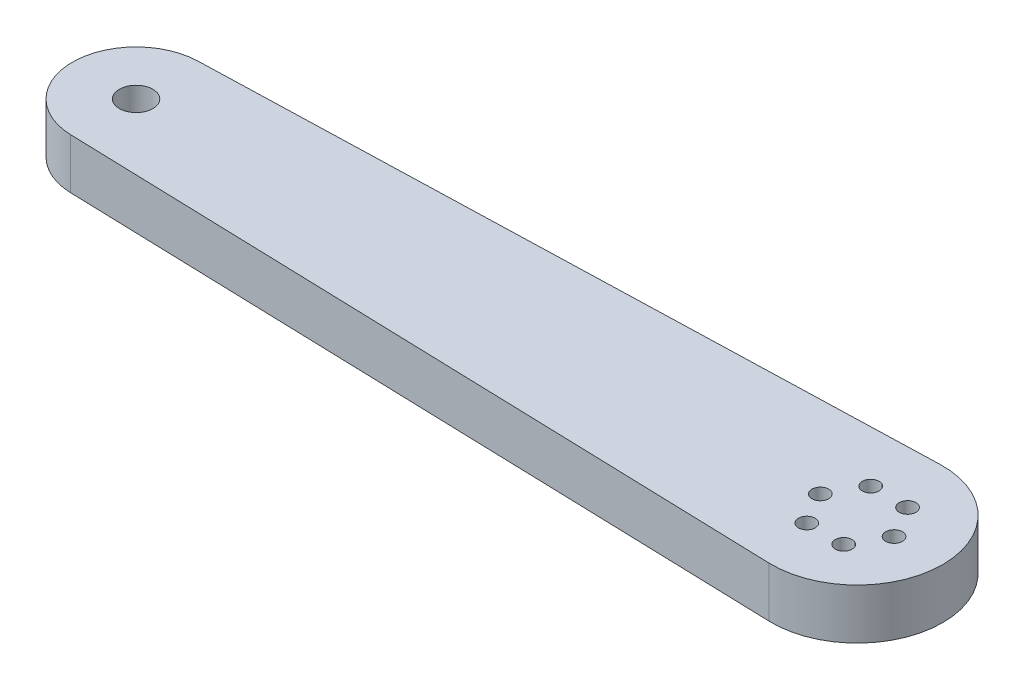
ISO-10303-21;
HEADER;
FILE_DESCRIPTION(('STEP AP214'),'2;1');
FILE_NAME('part.step','',(''),(''),'','','');
FILE_SCHEMA(('AUTOMOTIVE_DESIGN { 1 0 10303 214 1 1 1 1 }'));
ENDSEC;
DATA;
#1=APPLICATION_CONTEXT('core data for automotive mechanical design processes');
#2=APPLICATION_PROTOCOL_DEFINITION('international standard','automotive_design',2000,#1);
#3=PRODUCT_CONTEXT('',#1,'mechanical');
#4=PRODUCT('Part','Part','',(#3));
#5=PRODUCT_RELATED_PRODUCT_CATEGORY('part','',(#4));
#6=PRODUCT_DEFINITION_FORMATION('','',#4);
#7=PRODUCT_DEFINITION_CONTEXT('part definition',#1,'design');
#8=PRODUCT_DEFINITION('design','',#6,#7);
#9=PRODUCT_DEFINITION_SHAPE('','',#8);
#10=(LENGTH_UNIT() NAMED_UNIT(*) SI_UNIT(.MILLI.,.METRE.));
#11=(NAMED_UNIT(*) PLANE_ANGLE_UNIT() SI_UNIT($,.RADIAN.));
#12=(NAMED_UNIT(*) SI_UNIT($,.STERADIAN.) SOLID_ANGLE_UNIT());
#13=UNCERTAINTY_MEASURE_WITH_UNIT(LENGTH_MEASURE(1.E-05),#10,'distance_accuracy_value','');
#14=(GEOMETRIC_REPRESENTATION_CONTEXT(3) GLOBAL_UNCERTAINTY_ASSIGNED_CONTEXT((#13)) GLOBAL_UNIT_ASSIGNED_CONTEXT((#10,
#11,#12)) REPRESENTATION_CONTEXT('',''));
#15=CARTESIAN_POINT('',(0.,0.,0.));
#16=DIRECTION('',(0.,0.,1.));
#17=DIRECTION('',(1.,0.,0.));
#18=AXIS2_PLACEMENT_3D('',#15,#16,#17);
#19=CARTESIAN_POINT('',(0.,15.,0.));
#20=DIRECTION('',(0.,1.,0.));
#21=DIRECTION('',(0.,0.,1.));
#22=AXIS2_PLACEMENT_3D('',#19,#20,#21);
#23=PLANE('',#22);
#24=CARTESIAN_POINT('',(209.5,15.,9.52627944162886));
#25=DIRECTION('',(0.,1.,0.));
#26=DIRECTION('',(0.,0.,1.));
#27=AXIS2_PLACEMENT_3D('',#24,#25,#26);
#28=CIRCLE('',#27,2.5);
#29=CARTESIAN_POINT('',(209.5,15.,12.0262794416289));
#30=VERTEX_POINT('',#29);
#31=EDGE_CURVE('E168',#30,#30,#28,.T.);
#32=ORIENTED_EDGE('',*,*,#31,.F.);
#33=EDGE_LOOP('',(#32));
#34=FACE_BOUND('',#33,.T.);
#35=CARTESIAN_POINT('',(226.,15.,0.));
#36=DIRECTION('',(0.,1.,0.));
#37=DIRECTION('',(0.,0.,1.));
#38=AXIS2_PLACEMENT_3D('',#35,#36,#37);
#39=CIRCLE('',#38,2.5);
#40=CARTESIAN_POINT('',(226.,15.,2.49999999999998));
#41=VERTEX_POINT('',#40);
#42=EDGE_CURVE('E152',#41,#41,#39,.T.);
#43=ORIENTED_EDGE('',*,*,#42,.F.);
#44=EDGE_LOOP('',(#43));
#45=FACE_BOUND('',#44,.T.);
#46=CARTESIAN_POINT('',(220.5,15.,-9.52627944162881));
#47=DIRECTION('',(0.,1.,0.));
#48=DIRECTION('',(0.,0.,1.));
#49=AXIS2_PLACEMENT_3D('',#46,#47,#48);
#50=CIRCLE('',#49,2.5);
#51=CARTESIAN_POINT('',(220.5,15.,-7.02627944162882));
#52=VERTEX_POINT('',#51);
#53=EDGE_CURVE('E136',#52,#52,#50,.T.);
#54=ORIENTED_EDGE('',*,*,#53,.F.);
#55=EDGE_LOOP('',(#54));
#56=FACE_BOUND('',#55,.T.);
#57=CARTESIAN_POINT('',(0.,15.,0.));
#58=DIRECTION('',(0.,1.,0.));
#59=DIRECTION('',(0.,0.,1.));
#60=AXIS2_PLACEMENT_3D('',#57,#58,#59);
#61=CIRCLE('',#60,19.);
#62=CARTESIAN_POINT('',(-0.574418604651163,15.,-18.9913149430636));
#63=VERTEX_POINT('',#62);
#64=CARTESIAN_POINT('',(-0.574418604651163,15.,18.9913149430636));
#65=VERTEX_POINT('',#64);
#66=EDGE_CURVE('E94',#63,#65,#61,.T.);
#67=ORIENTED_EDGE('',*,*,#66,.T.);
#68=DIRECTION('',(0.999542891740189,0.,0.0302325581395349));
#69=VECTOR('',#68,1.);
#70=CARTESIAN_POINT('',(-0.574418604651163,15.,18.9913149430636));
#71=LINE('',#70,#69);
#72=CARTESIAN_POINT('',(214.229069767442,15.,25.4883437393748));
#73=VERTEX_POINT('',#72);
#74=EDGE_CURVE('E89',#65,#73,#71,.T.);
#75=ORIENTED_EDGE('',*,*,#74,.T.);
#76=CARTESIAN_POINT('',(215.,15.,0.));
#77=DIRECTION('',(0.,1.,0.));
#78=DIRECTION('',(0.,0.,-1.));
#79=AXIS2_PLACEMENT_3D('',#76,#77,#78);
#80=CIRCLE('',#79,25.5);
#81=CARTESIAN_POINT('',(214.229069767442,15.,-25.4883437393748));
#82=VERTEX_POINT('',#81);
#83=EDGE_CURVE('E92',#73,#82,#80,.T.);
#84=ORIENTED_EDGE('',*,*,#83,.T.);
#85=DIRECTION('',(-0.999542891740189,0.,0.0302325581395349));
#86=VECTOR('',#85,1.);
#87=CARTESIAN_POINT('',(-0.574418604651163,15.,-18.9913149430636));
#88=LINE('',#87,#86);
#89=EDGE_CURVE('E59',#82,#63,#88,.T.);
#90=ORIENTED_EDGE('',*,*,#89,.T.);
#91=EDGE_LOOP('',(#67,#75,#84,#90));
#92=FACE_BOUND('',#91,.T.);
#93=CARTESIAN_POINT('',(0.,15.,0.));
#94=DIRECTION('',(0.,1.,0.));
#95=DIRECTION('',(0.,0.,1.));
#96=AXIS2_PLACEMENT_3D('',#93,#94,#95);
#97=CIRCLE('',#96,5.);
#98=CARTESIAN_POINT('',(0.,15.,5.));
#99=VERTEX_POINT('',#98);
#100=EDGE_CURVE('E114',#99,#99,#97,.T.);
#101=ORIENTED_EDGE('',*,*,#100,.F.);
#102=EDGE_LOOP('',(#101));
#103=FACE_BOUND('',#102,.T.);
#104=CARTESIAN_POINT('',(209.5,15.,-9.52627944162881));
#105=DIRECTION('',(0.,1.,0.));
#106=DIRECTION('',(0.,0.,1.));
#107=AXIS2_PLACEMENT_3D('',#104,#105,#106);
#108=CIRCLE('',#107,2.5);
#109=CARTESIAN_POINT('',(209.5,15.,-7.02627944162882));
#110=VERTEX_POINT('',#109);
#111=EDGE_CURVE('E144',#110,#110,#108,.T.);
#112=ORIENTED_EDGE('',*,*,#111,.F.);
#113=EDGE_LOOP('',(#112));
#114=FACE_BOUND('',#113,.T.);
#115=CARTESIAN_POINT('',(220.5,15.,9.52627944162886));
#116=DIRECTION('',(0.,1.,0.));
#117=DIRECTION('',(0.,0.,1.));
#118=AXIS2_PLACEMENT_3D('',#115,#116,#117);
#119=CIRCLE('',#118,2.5);
#120=CARTESIAN_POINT('',(220.5,15.,12.0262794416289));
#121=VERTEX_POINT('',#120);
#122=EDGE_CURVE('E160',#121,#121,#119,.T.);
#123=ORIENTED_EDGE('',*,*,#122,.F.);
#124=EDGE_LOOP('',(#123));
#125=FACE_BOUND('',#124,.T.);
#126=CARTESIAN_POINT('',(204.,15.,0.));
#127=DIRECTION('',(0.,1.,0.));
#128=DIRECTION('',(0.,0.,1.));
#129=AXIS2_PLACEMENT_3D('',#126,#127,#128);
#130=CIRCLE('',#129,2.5);
#131=CARTESIAN_POINT('',(204.,15.,2.49999999999999));
#132=VERTEX_POINT('',#131);
#133=EDGE_CURVE('E176',#132,#132,#130,.T.);
#134=ORIENTED_EDGE('',*,*,#133,.F.);
#135=EDGE_LOOP('',(#134));
#136=FACE_BOUND('',#135,.T.);
#137=ADVANCED_FACE('F41',(#34,#45,#56,#92,#103,#114,#125,#136),#23,.T.);
#138=CARTESIAN_POINT('',(0.,0.,0.));
#139=DIRECTION('',(0.,1.,0.));
#140=DIRECTION('',(0.,0.,1.));
#141=AXIS2_PLACEMENT_3D('',#138,#139,#140);
#142=PLANE('',#141);
#143=CARTESIAN_POINT('',(0.,0.,0.));
#144=DIRECTION('',(0.,1.,0.));
#145=DIRECTION('',(0.,0.,1.));
#146=AXIS2_PLACEMENT_3D('',#143,#144,#145);
#147=CIRCLE('',#146,19.);
#148=CARTESIAN_POINT('',(-0.574418604651163,0.,-18.9913149430636));
#149=VERTEX_POINT('',#148);
#150=CARTESIAN_POINT('',(-0.574418604651163,0.,18.9913149430636));
#151=VERTEX_POINT('',#150);
#152=EDGE_CURVE('E110',#149,#151,#147,.T.);
#153=ORIENTED_EDGE('',*,*,#152,.F.);
#154=DIRECTION('',(-0.999542891740189,0.,0.0302325581395349));
#155=VECTOR('',#154,1.);
#156=CARTESIAN_POINT('',(-0.574418604651163,0.,-18.9913149430636));
#157=LINE('',#156,#155);
#158=CARTESIAN_POINT('',(214.229069767442,0.,-25.4883437393748));
#159=VERTEX_POINT('',#158);
#160=EDGE_CURVE('E82',#159,#149,#157,.T.);
#161=ORIENTED_EDGE('',*,*,#160,.F.);
#162=CARTESIAN_POINT('',(215.,0.,0.));
#163=DIRECTION('',(0.,1.,0.));
#164=DIRECTION('',(0.,0.,-1.));
#165=AXIS2_PLACEMENT_3D('',#162,#163,#164);
#166=CIRCLE('',#165,25.5);
#167=CARTESIAN_POINT('',(214.229069767442,0.,25.4883437393748));
#168=VERTEX_POINT('',#167);
#169=EDGE_CURVE('E76',#168,#159,#166,.T.);
#170=ORIENTED_EDGE('',*,*,#169,.F.);
#171=DIRECTION('',(0.999542891740189,0.,0.0302325581395349));
#172=VECTOR('',#171,1.);
#173=CARTESIAN_POINT('',(-0.574418604651163,0.,18.9913149430636));
#174=LINE('',#173,#172);
#175=EDGE_CURVE('E99',#151,#168,#174,.T.);
#176=ORIENTED_EDGE('',*,*,#175,.F.);
#177=EDGE_LOOP('',(#153,#161,#170,#176));
#178=FACE_BOUND('',#177,.T.);
#179=CARTESIAN_POINT('',(0.,0.,0.));
#180=DIRECTION('',(0.,1.,0.));
#181=DIRECTION('',(0.,0.,1.));
#182=AXIS2_PLACEMENT_3D('',#179,#180,#181);
#183=CIRCLE('',#182,5.);
#184=CARTESIAN_POINT('',(0.,0.,5.));
#185=VERTEX_POINT('',#184);
#186=EDGE_CURVE('E132',#185,#185,#183,.T.);
#187=ORIENTED_EDGE('',*,*,#186,.T.);
#188=EDGE_LOOP('',(#187));
#189=FACE_BOUND('',#188,.T.);
#190=CARTESIAN_POINT('',(220.5,0.,-9.52627944162881));
#191=DIRECTION('',(0.,1.,0.));
#192=DIRECTION('',(0.,0.,1.));
#193=AXIS2_PLACEMENT_3D('',#190,#191,#192);
#194=CIRCLE('',#193,2.5);
#195=CARTESIAN_POINT('',(220.5,0.,-7.02627944162882));
#196=VERTEX_POINT('',#195);
#197=EDGE_CURVE('E140',#196,#196,#194,.T.);
#198=ORIENTED_EDGE('',*,*,#197,.T.);
#199=EDGE_LOOP('',(#198));
#200=FACE_BOUND('',#199,.T.);
#201=CARTESIAN_POINT('',(209.5,0.,-9.52627944162881));
#202=DIRECTION('',(0.,1.,0.));
#203=DIRECTION('',(0.,0.,1.));
#204=AXIS2_PLACEMENT_3D('',#201,#202,#203);
#205=CIRCLE('',#204,2.5);
#206=CARTESIAN_POINT('',(209.5,0.,-7.02627944162882));
#207=VERTEX_POINT('',#206);
#208=EDGE_CURVE('E148',#207,#207,#205,.T.);
#209=ORIENTED_EDGE('',*,*,#208,.T.);
#210=EDGE_LOOP('',(#209));
#211=FACE_BOUND('',#210,.T.);
#212=CARTESIAN_POINT('',(226.,0.,0.));
#213=DIRECTION('',(0.,1.,0.));
#214=DIRECTION('',(0.,0.,1.));
#215=AXIS2_PLACEMENT_3D('',#212,#213,#214);
#216=CIRCLE('',#215,2.5);
#217=CARTESIAN_POINT('',(226.,0.,2.49999999999998));
#218=VERTEX_POINT('',#217);
#219=EDGE_CURVE('E156',#218,#218,#216,.T.);
#220=ORIENTED_EDGE('',*,*,#219,.T.);
#221=EDGE_LOOP('',(#220));
#222=FACE_BOUND('',#221,.T.);
#223=CARTESIAN_POINT('',(220.5,0.,9.52627944162886));
#224=DIRECTION('',(0.,1.,0.));
#225=DIRECTION('',(0.,0.,1.));
#226=AXIS2_PLACEMENT_3D('',#223,#224,#225);
#227=CIRCLE('',#226,2.5);
#228=CARTESIAN_POINT('',(220.5,0.,12.0262794416289));
#229=VERTEX_POINT('',#228);
#230=EDGE_CURVE('E164',#229,#229,#227,.T.);
#231=ORIENTED_EDGE('',*,*,#230,.T.);
#232=EDGE_LOOP('',(#231));
#233=FACE_BOUND('',#232,.T.);
#234=CARTESIAN_POINT('',(209.5,0.,9.52627944162886));
#235=DIRECTION('',(0.,1.,0.));
#236=DIRECTION('',(0.,0.,1.));
#237=AXIS2_PLACEMENT_3D('',#234,#235,#236);
#238=CIRCLE('',#237,2.5);
#239=CARTESIAN_POINT('',(209.5,0.,12.0262794416289));
#240=VERTEX_POINT('',#239);
#241=EDGE_CURVE('E172',#240,#240,#238,.T.);
#242=ORIENTED_EDGE('',*,*,#241,.T.);
#243=EDGE_LOOP('',(#242));
#244=FACE_BOUND('',#243,.T.);
#245=CARTESIAN_POINT('',(204.,0.,0.));
#246=DIRECTION('',(0.,1.,0.));
#247=DIRECTION('',(0.,0.,1.));
#248=AXIS2_PLACEMENT_3D('',#245,#246,#247);
#249=CIRCLE('',#248,2.5);
#250=CARTESIAN_POINT('',(204.,0.,2.49999999999999));
#251=VERTEX_POINT('',#250);
#252=EDGE_CURVE('E180',#251,#251,#249,.T.);
#253=ORIENTED_EDGE('',*,*,#252,.T.);
#254=EDGE_LOOP('',(#253));
#255=FACE_BOUND('',#254,.T.);
#256=ADVANCED_FACE('F127',(#178,#189,#200,#211,#222,#233,#244,#255),#142,.F.);
#257=CARTESIAN_POINT('',(0.,15.,0.));
#258=DIRECTION('',(0.,-1.,0.));
#259=DIRECTION('',(0.,0.,-1.));
#260=AXIS2_PLACEMENT_3D('',#257,#258,#259);
#261=CYLINDRICAL_SURFACE('',#260,19.);
#262=ORIENTED_EDGE('',*,*,#152,.T.);
#263=DIRECTION('',(0.,-1.,0.));
#264=VECTOR('',#263,1.);
#265=CARTESIAN_POINT('',(-0.574418604651163,15.,18.9913149430636));
#266=LINE('',#265,#264);
#267=EDGE_CURVE('E11',#65,#151,#266,.T.);
#268=ORIENTED_EDGE('',*,*,#267,.F.);
#269=ORIENTED_EDGE('',*,*,#66,.F.);
#270=DIRECTION('',(0.,-1.,0.));
#271=VECTOR('',#270,1.);
#272=CARTESIAN_POINT('',(-0.574418604651163,15.,-18.9913149430636));
#273=LINE('',#272,#271);
#274=EDGE_CURVE('E106',#63,#149,#273,.T.);
#275=ORIENTED_EDGE('',*,*,#274,.T.);
#276=EDGE_LOOP('',(#262,#268,#269,#275));
#277=FACE_BOUND('',#276,.T.);
#278=ADVANCED_FACE('F43',(#277),#261,.T.);
#279=CARTESIAN_POINT('',(-0.574418604651163,15.,18.9913149430636));
#280=DIRECTION('',(0.0302325581395349,0.,-0.999542891740189));
#281=DIRECTION('',(-0.999542891740189,0.,-0.0302325581395349));
#282=AXIS2_PLACEMENT_3D('',#279,#280,#281);
#283=PLANE('',#282);
#284=ORIENTED_EDGE('',*,*,#175,.T.);
#285=DIRECTION('',(0.,-1.,0.));
#286=VECTOR('',#285,1.);
#287=CARTESIAN_POINT('',(214.229069767442,15.,25.4883437393748));
#288=LINE('',#287,#286);
#289=EDGE_CURVE('E51',#73,#168,#288,.T.);
#290=ORIENTED_EDGE('',*,*,#289,.F.);
#291=ORIENTED_EDGE('',*,*,#74,.F.);
#292=ORIENTED_EDGE('',*,*,#267,.T.);
#293=EDGE_LOOP('',(#284,#290,#291,#292));
#294=FACE_BOUND('',#293,.T.);
#295=ADVANCED_FACE('F98',(#294),#283,.F.);
#296=CARTESIAN_POINT('',(215.,15.,0.));
#297=DIRECTION('',(0.,-1.,0.));
#298=DIRECTION('',(0.,0.,-1.));
#299=AXIS2_PLACEMENT_3D('',#296,#297,#298);
#300=CYLINDRICAL_SURFACE('',#299,25.5);
#301=ORIENTED_EDGE('',*,*,#169,.T.);
#302=DIRECTION('',(0.,-1.,0.));
#303=VECTOR('',#302,1.);
#304=CARTESIAN_POINT('',(214.229069767442,15.,-25.4883437393748));
#305=LINE('',#304,#303);
#306=EDGE_CURVE('E101',#82,#159,#305,.T.);
#307=ORIENTED_EDGE('',*,*,#306,.F.);
#308=ORIENTED_EDGE('',*,*,#83,.F.);
#309=ORIENTED_EDGE('',*,*,#289,.T.);
#310=EDGE_LOOP('',(#301,#307,#308,#309));
#311=FACE_BOUND('',#310,.T.);
#312=ADVANCED_FACE('F102',(#311),#300,.T.);
#313=CARTESIAN_POINT('',(-0.574418604651163,15.,-18.9913149430636));
#314=DIRECTION('',(0.0302325581395349,0.,0.999542891740189));
#315=DIRECTION('',(0.999542891740189,0.,-0.0302325581395349));
#316=AXIS2_PLACEMENT_3D('',#313,#314,#315);
#317=PLANE('',#316);
#318=ORIENTED_EDGE('',*,*,#160,.T.);
#319=ORIENTED_EDGE('',*,*,#274,.F.);
#320=ORIENTED_EDGE('',*,*,#89,.F.);
#321=ORIENTED_EDGE('',*,*,#306,.T.);
#322=EDGE_LOOP('',(#318,#319,#320,#321));
#323=FACE_BOUND('',#322,.T.);
#324=ADVANCED_FACE('F124',(#323),#317,.F.);
#325=CARTESIAN_POINT('',(0.,15.,0.));
#326=DIRECTION('',(0.,-1.,0.));
#327=DIRECTION('',(0.,0.,-1.));
#328=AXIS2_PLACEMENT_3D('',#325,#326,#327);
#329=CYLINDRICAL_SURFACE('',#328,5.);
#330=ORIENTED_EDGE('',*,*,#100,.T.);
#331=EDGE_LOOP('',(#330));
#332=FACE_BOUND('',#331,.T.);
#333=ORIENTED_EDGE('',*,*,#186,.F.);
#334=EDGE_LOOP('',(#333));
#335=FACE_BOUND('',#334,.T.);
#336=ADVANCED_FACE('F201',(#332,#335),#329,.F.);
#337=CARTESIAN_POINT('',(220.5,15.,-9.52627944162881));
#338=DIRECTION('',(0.,-1.,0.));
#339=DIRECTION('',(0.,0.,-1.));
#340=AXIS2_PLACEMENT_3D('',#337,#338,#339);
#341=CYLINDRICAL_SURFACE('',#340,2.5);
#342=ORIENTED_EDGE('',*,*,#53,.T.);
#343=EDGE_LOOP('',(#342));
#344=FACE_BOUND('',#343,.T.);
#345=ORIENTED_EDGE('',*,*,#197,.F.);
#346=EDGE_LOOP('',(#345));
#347=FACE_BOUND('',#346,.T.);
#348=ADVANCED_FACE('F253',(#344,#347),#341,.F.);
#349=CARTESIAN_POINT('',(209.5,15.,-9.52627944162881));
#350=DIRECTION('',(0.,-1.,0.));
#351=DIRECTION('',(0.,0.,-1.));
#352=AXIS2_PLACEMENT_3D('',#349,#350,#351);
#353=CYLINDRICAL_SURFACE('',#352,2.5);
#354=ORIENTED_EDGE('',*,*,#111,.T.);
#355=EDGE_LOOP('',(#354));
#356=FACE_BOUND('',#355,.T.);
#357=ORIENTED_EDGE('',*,*,#208,.F.);
#358=EDGE_LOOP('',(#357));
#359=FACE_BOUND('',#358,.T.);
#360=ADVANCED_FACE('F262',(#356,#359),#353,.F.);
#361=CARTESIAN_POINT('',(226.,15.,0.));
#362=DIRECTION('',(0.,-1.,0.));
#363=DIRECTION('',(0.,0.,-1.));
#364=AXIS2_PLACEMENT_3D('',#361,#362,#363);
#365=CYLINDRICAL_SURFACE('',#364,2.5);
#366=ORIENTED_EDGE('',*,*,#42,.T.);
#367=EDGE_LOOP('',(#366));
#368=FACE_BOUND('',#367,.T.);
#369=ORIENTED_EDGE('',*,*,#219,.F.);
#370=EDGE_LOOP('',(#369));
#371=FACE_BOUND('',#370,.T.);
#372=ADVANCED_FACE('F271',(#368,#371),#365,.F.);
#373=CARTESIAN_POINT('',(220.5,15.,9.52627944162886));
#374=DIRECTION('',(0.,-1.,0.));
#375=DIRECTION('',(0.,0.,-1.));
#376=AXIS2_PLACEMENT_3D('',#373,#374,#375);
#377=CYLINDRICAL_SURFACE('',#376,2.5);
#378=ORIENTED_EDGE('',*,*,#122,.T.);
#379=EDGE_LOOP('',(#378));
#380=FACE_BOUND('',#379,.T.);
#381=ORIENTED_EDGE('',*,*,#230,.F.);
#382=EDGE_LOOP('',(#381));
#383=FACE_BOUND('',#382,.T.);
#384=ADVANCED_FACE('F281',(#380,#383),#377,.F.);
#385=CARTESIAN_POINT('',(209.5,15.,9.52627944162886));
#386=DIRECTION('',(0.,-1.,0.));
#387=DIRECTION('',(0.,0.,-1.));
#388=AXIS2_PLACEMENT_3D('',#385,#386,#387);
#389=CYLINDRICAL_SURFACE('',#388,2.5);
#390=ORIENTED_EDGE('',*,*,#31,.T.);
#391=EDGE_LOOP('',(#390));
#392=FACE_BOUND('',#391,.T.);
#393=ORIENTED_EDGE('',*,*,#241,.F.);
#394=EDGE_LOOP('',(#393));
#395=FACE_BOUND('',#394,.T.);
#396=ADVANCED_FACE('F291',(#392,#395),#389,.F.);
#397=CARTESIAN_POINT('',(204.,15.,0.));
#398=DIRECTION('',(0.,-1.,0.));
#399=DIRECTION('',(0.,0.,-1.));
#400=AXIS2_PLACEMENT_3D('',#397,#398,#399);
#401=CYLINDRICAL_SURFACE('',#400,2.5);
#402=ORIENTED_EDGE('',*,*,#133,.T.);
#403=EDGE_LOOP('',(#402));
#404=FACE_BOUND('',#403,.T.);
#405=ORIENTED_EDGE('',*,*,#252,.F.);
#406=EDGE_LOOP('',(#405));
#407=FACE_BOUND('',#406,.T.);
#408=ADVANCED_FACE('F188',(#404,#407),#401,.F.);
#409=CLOSED_SHELL('',(#137,#256,#278,#295,#312,#324,#336,#348,#360,#372,#384,#396,#408));
#410=MANIFOLD_SOLID_BREP('B2',#409);
#411=ADVANCED_BREP_SHAPE_REPRESENTATION('',(#18,#410),#14);
#412=SHAPE_DEFINITION_REPRESENTATION(#9,#411);
ENDSEC;
END-ISO-10303-21;
